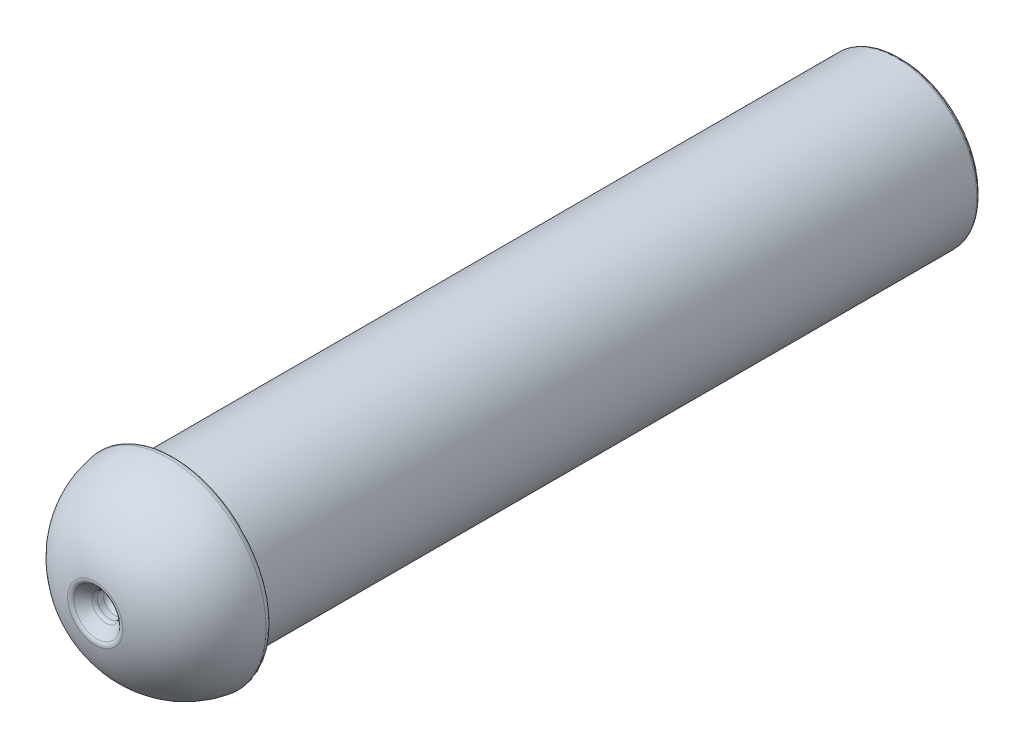
ISO-10303-21;
HEADER;
FILE_DESCRIPTION(('STEP AP214'),'2;1');
FILE_NAME('part.step','',(''),(''),'','','');
FILE_SCHEMA(('AUTOMOTIVE_DESIGN { 1 0 10303 214 1 1 1 1 }'));
ENDSEC;
DATA;
#1=APPLICATION_CONTEXT('core data for automotive mechanical design processes');
#2=APPLICATION_PROTOCOL_DEFINITION('international standard','automotive_design',2000,#1);
#3=PRODUCT_CONTEXT('',#1,'mechanical');
#4=PRODUCT('Part','Part','',(#3));
#5=PRODUCT_RELATED_PRODUCT_CATEGORY('part','',(#4));
#6=PRODUCT_DEFINITION_FORMATION('','',#4);
#7=PRODUCT_DEFINITION_CONTEXT('part definition',#1,'design');
#8=PRODUCT_DEFINITION('design','',#6,#7);
#9=PRODUCT_DEFINITION_SHAPE('','',#8);
#10=(LENGTH_UNIT() NAMED_UNIT(*) SI_UNIT(.MILLI.,.METRE.));
#11=(NAMED_UNIT(*) PLANE_ANGLE_UNIT() SI_UNIT($,.RADIAN.));
#12=(NAMED_UNIT(*) SI_UNIT($,.STERADIAN.) SOLID_ANGLE_UNIT());
#13=UNCERTAINTY_MEASURE_WITH_UNIT(LENGTH_MEASURE(1.E-05),#10,'distance_accuracy_value','');
#14=(GEOMETRIC_REPRESENTATION_CONTEXT(3) GLOBAL_UNCERTAINTY_ASSIGNED_CONTEXT((#13)) GLOBAL_UNIT_ASSIGNED_CONTEXT((#10,
#11,#12)) REPRESENTATION_CONTEXT('',''));
#15=CARTESIAN_POINT('',(0.,0.,0.));
#16=DIRECTION('',(0.,0.,1.));
#17=DIRECTION('',(1.,0.,0.));
#18=AXIS2_PLACEMENT_3D('',#15,#16,#17);
#19=CARTESIAN_POINT('',(0.,0.,27.05));
#20=DIRECTION('',(0.,0.,-1.));
#21=DIRECTION('',(-1.,0.,0.));
#22=AXIS2_PLACEMENT_3D('',#19,#20,#21);
#23=CYLINDRICAL_SURFACE('',#22,3.);
#24=CARTESIAN_POINT('',(0.,0.,0.241421356237306));
#25=DIRECTION('',(0.,0.,-1.));
#26=DIRECTION('',(-1.,0.,0.));
#27=AXIS2_PLACEMENT_3D('',#24,#25,#26);
#28=CIRCLE('',#27,3.);
#29=CARTESIAN_POINT('',(-3.,0.,0.241421356237306));
#30=VERTEX_POINT('',#29);
#31=EDGE_CURVE('E67',#30,#30,#28,.F.);
#32=ORIENTED_EDGE('',*,*,#31,.T.);
#33=EDGE_LOOP('',(#32));
#34=FACE_BOUND('',#33,.T.);
#35=CARTESIAN_POINT('',(0.,0.,27.05));
#36=DIRECTION('',(0.,0.,1.));
#37=DIRECTION('',(1.,0.,0.));
#38=AXIS2_PLACEMENT_3D('',#35,#36,#37);
#39=CIRCLE('',#38,3.);
#40=CARTESIAN_POINT('',(3.,0.,27.05));
#41=VERTEX_POINT('',#40);
#42=EDGE_CURVE('E103',#41,#41,#39,.T.);
#43=ORIENTED_EDGE('',*,*,#42,.F.);
#44=EDGE_LOOP('',(#43));
#45=FACE_BOUND('',#44,.T.);
#46=ADVANCED_FACE('F39',(#34,#45),#23,.T.);
#47=CARTESIAN_POINT('',(0.,0.,0.));
#48=DIRECTION('',(0.,0.,1.));
#49=DIRECTION('',(1.,0.,0.));
#50=AXIS2_PLACEMENT_3D('',#47,#48,#49);
#51=PLANE('',#50);
#52=CARTESIAN_POINT('',(0.,0.,0.));
#53=DIRECTION('',(0.,0.,1.));
#54=DIRECTION('',(1.,0.,0.));
#55=AXIS2_PLACEMENT_3D('',#52,#53,#54);
#56=CIRCLE('',#55,2.75857864376269);
#57=CARTESIAN_POINT('',(2.75857864376269,0.,0.));
#58=VERTEX_POINT('',#57);
#59=EDGE_CURVE('E53',#58,#58,#56,.F.);
#60=ORIENTED_EDGE('',*,*,#59,.T.);
#61=EDGE_LOOP('',(#60));
#62=FACE_BOUND('',#61,.T.);
#63=CARTESIAN_POINT('',(0.,0.,0.));
#64=DIRECTION('',(0.,0.,1.));
#65=DIRECTION('',(1.,0.,0.));
#66=AXIS2_PLACEMENT_3D('',#63,#64,#65);
#67=CIRCLE('',#66,2.6260011275733);
#68=CARTESIAN_POINT('',(2.6260011275733,0.,0.));
#69=VERTEX_POINT('',#68);
#70=EDGE_CURVE('E56',#69,#69,#67,.T.);
#71=ORIENTED_EDGE('',*,*,#70,.T.);
#72=EDGE_LOOP('',(#71));
#73=FACE_BOUND('',#72,.T.);
#74=ADVANCED_FACE('F108',(#62,#73),#51,.F.);
#75=CARTESIAN_POINT('',(0.,0.,27.05));
#76=DIRECTION('',(0.,0.,1.));
#77=DIRECTION('',(1.,0.,0.));
#78=AXIS2_PLACEMENT_3D('',#75,#76,#77);
#79=PLANE('',#78);
#80=CARTESIAN_POINT('',(0.,0.,27.05));
#81=DIRECTION('',(0.,0.,1.));
#82=DIRECTION('',(1.,0.,0.));
#83=AXIS2_PLACEMENT_3D('',#80,#81,#82);
#84=CIRCLE('',#83,3.42811485811091);
#85=CARTESIAN_POINT('',(3.42811485811091,0.,27.05));
#86=VERTEX_POINT('',#85);
#87=EDGE_CURVE('E91',#86,#86,#84,.F.);
#88=ORIENTED_EDGE('',*,*,#87,.T.);
#89=EDGE_LOOP('',(#88));
#90=FACE_BOUND('',#89,.T.);
#91=ORIENTED_EDGE('',*,*,#42,.T.);
#92=EDGE_LOOP('',(#91));
#93=FACE_BOUND('',#92,.T.);
#94=ADVANCED_FACE('F102',(#90,#93),#79,.F.);
#95=CARTESIAN_POINT('',(0.,0.,26.85));
#96=DIRECTION('',(0.,0.,-1.));
#97=DIRECTION('',(-1.,0.,0.));
#98=AXIS2_PLACEMENT_3D('',#95,#96,#97);
#99=DEGENERATE_TOROIDAL_SURFACE('',#98,0.454901108647211,3.2,.T.);
#100=CARTESIAN_POINT('',(0.,0.,29.9987448238278));
#101=DIRECTION('',(0.,0.,-1.));
#102=DIRECTION('',(-1.,0.,0.));
#103=AXIS2_PLACEMENT_3D('',#100,#101,#102);
#104=CIRCLE('',#103,1.02534482578127);
#105=CARTESIAN_POINT('',(-1.02534482578127,0.,29.9987448238278));
#106=VERTEX_POINT('',#105);
#107=EDGE_CURVE('E89',#106,#106,#104,.T.);
#108=ORIENTED_EDGE('',*,*,#107,.T.);
#109=EDGE_LOOP('',(#108));
#110=FACE_BOUND('',#109,.T.);
#111=CARTESIAN_POINT('',(0.,0.,27.2766666666667));
#112=DIRECTION('',(0.,0.,-1.));
#113=DIRECTION('',(-1.,0.,0.));
#114=AXIS2_PLACEMENT_3D('',#111,#112,#113);
#115=CIRCLE('',#114,3.62632910807516);
#116=CARTESIAN_POINT('',(-3.62632910807516,0.,27.2766666666667));
#117=VERTEX_POINT('',#116);
#118=EDGE_CURVE('E96',#117,#117,#115,.F.);
#119=ORIENTED_EDGE('',*,*,#118,.T.);
#120=EDGE_LOOP('',(#119));
#121=FACE_BOUND('',#120,.T.);
#122=ADVANCED_FACE('F118',(#110,#121),#99,.T.);
#123=CARTESIAN_POINT('',(0.,0.,27.25));
#124=DIRECTION('',(0.,0.,1.));
#125=DIRECTION('',(1.,0.,0.));
#126=AXIS2_PLACEMENT_3D('',#123,#124,#125);
#127=TOROIDAL_SURFACE('',#126,3.42811485811091,0.2);
#128=ORIENTED_EDGE('',*,*,#87,.F.);
#129=EDGE_LOOP('',(#128));
#130=FACE_BOUND('',#129,.T.);
#131=ORIENTED_EDGE('',*,*,#118,.F.);
#132=EDGE_LOOP('',(#131));
#133=FACE_BOUND('',#132,.T.);
#134=ADVANCED_FACE('F125',(#130,#133),#127,.T.);
#135=CARTESIAN_POINT('',(0.,0.,29.05));
#136=DIRECTION('',(0.,0.,1.));
#137=DIRECTION('',(1.,0.,0.));
#138=AXIS2_PLACEMENT_3D('',#135,#136,#137);
#139=CYLINDRICAL_SURFACE('',#138,0.454901108647211);
#140=CARTESIAN_POINT('',(0.,0.,29.4671572875254));
#141=DIRECTION('',(0.,0.,-1.));
#142=DIRECTION('',(-1.,0.,0.));
#143=AXIS2_PLACEMENT_3D('',#140,#141,#142);
#144=CIRCLE('',#143,0.454901108647211);
#145=CARTESIAN_POINT('',(-0.454901108647211,0.,29.4671572875254));
#146=VERTEX_POINT('',#145);
#147=EDGE_CURVE('E80',#146,#146,#144,.F.);
#148=ORIENTED_EDGE('',*,*,#147,.T.);
#149=EDGE_LOOP('',(#148));
#150=FACE_BOUND('',#149,.T.);
#151=CARTESIAN_POINT('',(0.,0.,29.25));
#152=DIRECTION('',(0.,0.,1.));
#153=DIRECTION('',(1.,0.,0.));
#154=AXIS2_PLACEMENT_3D('',#151,#152,#153);
#155=CIRCLE('',#154,0.454901108647211);
#156=CARTESIAN_POINT('',(0.454901108647211,0.,29.25));
#157=VERTEX_POINT('',#156);
#158=EDGE_CURVE('E88',#157,#157,#155,.F.);
#159=ORIENTED_EDGE('',*,*,#158,.T.);
#160=EDGE_LOOP('',(#159));
#161=FACE_BOUND('',#160,.T.);
#162=ADVANCED_FACE('F127',(#150,#161),#139,.F.);
#163=CARTESIAN_POINT('',(0.,0.,29.05));
#164=DIRECTION('',(0.,0.,1.));
#165=DIRECTION('',(1.,0.,0.));
#166=AXIS2_PLACEMENT_3D('',#163,#164,#165);
#167=PLANE('',#166);
#168=CARTESIAN_POINT('',(0.,0.,29.05));
#169=DIRECTION('',(0.,0.,1.));
#170=DIRECTION('',(1.,0.,0.));
#171=AXIS2_PLACEMENT_3D('',#168,#169,#170);
#172=CIRCLE('',#171,0.254901108647211);
#173=CARTESIAN_POINT('',(0.254901108647211,0.,29.05));
#174=VERTEX_POINT('',#173);
#175=EDGE_CURVE('E95',#174,#174,#172,.T.);
#176=ORIENTED_EDGE('',*,*,#175,.T.);
#177=EDGE_LOOP('',(#176));
#178=FACE_BOUND('',#177,.T.);
#179=ADVANCED_FACE('F135',(#178),#167,.T.);
#180=CARTESIAN_POINT('',(0.,0.,29.25));
#181=DIRECTION('',(0.,0.,1.));
#182=DIRECTION('',(1.,0.,0.));
#183=AXIS2_PLACEMENT_3D('',#180,#181,#182);
#184=TOROIDAL_SURFACE('',#183,0.254901108647211,0.2);
#185=ORIENTED_EDGE('',*,*,#158,.F.);
#186=EDGE_LOOP('',(#185));
#187=FACE_BOUND('',#186,.T.);
#188=ORIENTED_EDGE('',*,*,#175,.F.);
#189=EDGE_LOOP('',(#188));
#190=FACE_BOUND('',#189,.T.);
#191=ADVANCED_FACE('F129',(#187,#190),#184,.F.);
#192=CARTESIAN_POINT('',(0.,0.,29.55));
#193=DIRECTION('',(0.,0.,1.));
#194=DIRECTION('',(1.,0.,0.));
#195=AXIS2_PLACEMENT_3D('',#192,#193,#194);
#196=CONICAL_SURFACE('',#195,0.454901108647211,0.785398163397455);
#197=CARTESIAN_POINT('',(0.,0.,29.9433696285759));
#198=DIRECTION('',(0.,0.,-1.));
#199=DIRECTION('',(-1.,0.,0.));
#200=AXIS2_PLACEMENT_3D('',#197,#198,#199);
#201=CIRCLE('',#200,0.848270737223083);
#202=CARTESIAN_POINT('',(-0.848270737223083,0.,29.9433696285759));
#203=VERTEX_POINT('',#202);
#204=EDGE_CURVE('E78',#203,#203,#201,.F.);
#205=ORIENTED_EDGE('',*,*,#204,.T.);
#206=EDGE_LOOP('',(#205));
#207=FACE_BOUND('',#206,.T.);
#208=CARTESIAN_POINT('',(0.,0.,29.6085786437627));
#209=DIRECTION('',(0.,0.,1.));
#210=DIRECTION('',(1.,0.,0.));
#211=AXIS2_PLACEMENT_3D('',#208,#209,#210);
#212=CIRCLE('',#211,0.513479752409901);
#213=CARTESIAN_POINT('',(0.513479752409901,0.,29.6085786437627));
#214=VERTEX_POINT('',#213);
#215=EDGE_CURVE('E84',#214,#214,#212,.F.);
#216=ORIENTED_EDGE('',*,*,#215,.T.);
#217=EDGE_LOOP('',(#216));
#218=FACE_BOUND('',#217,.T.);
#219=ADVANCED_FACE('F131',(#207,#218),#196,.F.);
#220=CARTESIAN_POINT('',(0.,0.,29.8019482723385));
#221=DIRECTION('',(0.,0.,1.));
#222=DIRECTION('',(1.,0.,0.));
#223=AXIS2_PLACEMENT_3D('',#220,#221,#222);
#224=TOROIDAL_SURFACE('',#223,0.989692093460391,0.2);
#225=ORIENTED_EDGE('',*,*,#204,.F.);
#226=EDGE_LOOP('',(#225));
#227=FACE_BOUND('',#226,.T.);
#228=ORIENTED_EDGE('',*,*,#107,.F.);
#229=EDGE_LOOP('',(#228));
#230=FACE_BOUND('',#229,.T.);
#231=ADVANCED_FACE('F139',(#227,#230),#224,.T.);
#232=CARTESIAN_POINT('',(0.,0.,29.4671572875254));
#233=DIRECTION('',(0.,0.,-1.));
#234=DIRECTION('',(-1.,0.,0.));
#235=AXIS2_PLACEMENT_3D('',#232,#233,#234);
#236=TOROIDAL_SURFACE('',#235,0.654901108647211,0.2);
#237=ORIENTED_EDGE('',*,*,#215,.F.);
#238=EDGE_LOOP('',(#237));
#239=FACE_BOUND('',#238,.T.);
#240=ORIENTED_EDGE('',*,*,#147,.F.);
#241=EDGE_LOOP('',(#240));
#242=FACE_BOUND('',#241,.T.);
#243=ADVANCED_FACE('F144',(#239,#242),#236,.T.);
#244=CARTESIAN_POINT('',(0.,0.,25.));
#245=DIRECTION('',(0.,0.,-1.));
#246=DIRECTION('',(-1.,0.,0.));
#247=AXIS2_PLACEMENT_3D('',#244,#245,#246);
#248=CYLINDRICAL_SURFACE('',#247,2.38457977133597);
#249=CARTESIAN_POINT('',(0.,0.,0.24142135623733));
#250=DIRECTION('',(0.,0.,1.));
#251=DIRECTION('',(1.,0.,0.));
#252=AXIS2_PLACEMENT_3D('',#249,#250,#251);
#253=CIRCLE('',#252,2.38457977133597);
#254=CARTESIAN_POINT('',(-2.38457977133597,0.,0.24142135623733));
#255=VERTEX_POINT('',#254);
#256=EDGE_CURVE('E10',#255,#255,#253,.F.);
#257=CARTESIAN_POINT('',(0.,0.,24.));
#258=DIRECTION('',(0.,0.,-1.));
#259=DIRECTION('',(-1.,0.,0.));
#260=AXIS2_PLACEMENT_3D('',#257,#258,#259);
#261=CIRCLE('',#260,2.38457977133597);
#262=CARTESIAN_POINT('',(-2.38457977133597,0.,24.));
#263=VERTEX_POINT('',#262);
#264=EDGE_CURVE('E71',#263,#263,#261,.F.);
#265=CARTESIAN_POINT('',(-2.38457977133597,0.,0.24142135623733));
#266=CARTESIAN_POINT('',(-2.38457977133597,0.,0.488906550443191));
#267=CARTESIAN_POINT('',(-2.38457977133597,0.,0.736391744649051));
#268=CARTESIAN_POINT('',(-2.38457977133597,0.,1.23136213306077));
#269=CARTESIAN_POINT('',(-2.38457977133597,0.,1.47884732726664));
#270=CARTESIAN_POINT('',(-2.38457977133597,0.,1.97381771567836));
#271=CARTESIAN_POINT('',(-2.38457977133597,0.,2.22130290988422));
#272=CARTESIAN_POINT('',(-2.38457977133597,0.,2.71627329829594));
#273=CARTESIAN_POINT('',(-2.38457977133597,0.,2.96375849250181));
#274=CARTESIAN_POINT('',(-2.38457977133597,0.,3.45872888091353));
#275=CARTESIAN_POINT('',(-2.38457977133597,0.,3.70621407511939));
#276=CARTESIAN_POINT('',(-2.38457977133597,0.,4.20118446353111));
#277=CARTESIAN_POINT('',(-2.38457977133597,0.,4.44866965773697));
#278=CARTESIAN_POINT('',(-2.38457977133597,0.,4.94364004614869));
#279=CARTESIAN_POINT('',(-2.38457977133597,0.,5.19112524035456));
#280=CARTESIAN_POINT('',(-2.38457977133597,0.,5.68609562876628));
#281=CARTESIAN_POINT('',(-2.38457977133597,0.,5.93358082297214));
#282=CARTESIAN_POINT('',(-2.38457977133597,0.,6.42855121138386));
#283=CARTESIAN_POINT('',(-2.38457977133597,0.,6.67603640558972));
#284=CARTESIAN_POINT('',(-2.38457977133597,0.,7.17100679400145));
#285=CARTESIAN_POINT('',(-2.38457977133597,0.,7.41849198820731));
#286=CARTESIAN_POINT('',(-2.38457977133597,0.,7.91346237661903));
#287=CARTESIAN_POINT('',(-2.38457977133597,0.,8.16094757082489));
#288=CARTESIAN_POINT('',(-2.38457977133597,0.,8.65591795923661));
#289=CARTESIAN_POINT('',(-2.38457977133597,0.,8.90340315344248));
#290=CARTESIAN_POINT('',(-2.38457977133597,0.,9.3983735418542));
#291=CARTESIAN_POINT('',(-2.38457977133597,0.,9.64585873606006));
#292=CARTESIAN_POINT('',(-2.38457977133597,0.,10.1408291244718));
#293=CARTESIAN_POINT('',(-2.38457977133597,0.,10.3883143186776));
#294=CARTESIAN_POINT('',(-2.38457977133597,0.,10.8832847070894));
#295=CARTESIAN_POINT('',(-2.38457977133597,0.,11.1307699012952));
#296=CARTESIAN_POINT('',(-2.38457977133597,0.,11.6257402897069));
#297=CARTESIAN_POINT('',(-2.38457977133597,0.,11.8732254839128));
#298=CARTESIAN_POINT('',(-2.38457977133597,0.,12.3681958723245));
#299=CARTESIAN_POINT('',(-2.38457977133597,0.,12.6156810665304));
#300=CARTESIAN_POINT('',(-2.38457977133597,0.,13.1106514549421));
#301=CARTESIAN_POINT('',(-2.38457977133597,0.,13.358136649148));
#302=CARTESIAN_POINT('',(-2.38457977133597,0.,13.8531070375597));
#303=CARTESIAN_POINT('',(-2.38457977133597,0.,14.1005922317656));
#304=CARTESIAN_POINT('',(-2.38457977133597,0.,14.5955626201773));
#305=CARTESIAN_POINT('',(-2.38457977133597,0.,14.8430478143831));
#306=CARTESIAN_POINT('',(-2.38457977133597,0.,15.3380182027949));
#307=CARTESIAN_POINT('',(-2.38457977133597,0.,15.5855033970007));
#308=CARTESIAN_POINT('',(-2.38457977133597,0.,16.0804737854125));
#309=CARTESIAN_POINT('',(-2.38457977133597,0.,16.3279589796183));
#310=CARTESIAN_POINT('',(-2.38457977133597,0.,16.82292936803));
#311=CARTESIAN_POINT('',(-2.38457977133597,0.,17.0704145622359));
#312=CARTESIAN_POINT('',(-2.38457977133597,0.,17.5653849506476));
#313=CARTESIAN_POINT('',(-2.38457977133597,0.,17.8128701448535));
#314=CARTESIAN_POINT('',(-2.38457977133597,0.,18.3078405332652));
#315=CARTESIAN_POINT('',(-2.38457977133597,0.,18.5553257274711));
#316=CARTESIAN_POINT('',(-2.38457977133597,0.,19.0502961158828));
#317=CARTESIAN_POINT('',(-2.38457977133597,0.,19.2977813100886));
#318=CARTESIAN_POINT('',(-2.38457977133597,0.,19.7927516985004));
#319=CARTESIAN_POINT('',(-2.38457977133597,0.,20.0402368927062));
#320=CARTESIAN_POINT('',(-2.38457977133597,0.,20.535207281118));
#321=CARTESIAN_POINT('',(-2.38457977133597,0.,20.7826924753238));
#322=CARTESIAN_POINT('',(-2.38457977133597,0.,21.2776628637355));
#323=CARTESIAN_POINT('',(-2.38457977133597,0.,21.5251480579414));
#324=CARTESIAN_POINT('',(-2.38457977133597,0.,22.0201184463531));
#325=CARTESIAN_POINT('',(-2.38457977133597,0.,22.267603640559));
#326=CARTESIAN_POINT('',(-2.38457977133597,0.,22.7625740289707));
#327=CARTESIAN_POINT('',(-2.38457977133597,0.,23.0100592231766));
#328=CARTESIAN_POINT('',(-2.38457977133597,0.,23.5050296115883));
#329=CARTESIAN_POINT('',(-2.38457977133597,0.,23.7525148057941));
#330=CARTESIAN_POINT('',(-2.38457977133597,0.,24.));
#331=B_SPLINE_CURVE_WITH_KNOTS('',3,(#265,#266,#267,#268,#269,#270,#271,#272,#273,#274,#275,
#276,#277,#278,#279,#280,#281,#282,#283,#284,#285,#286,#287,#288,#289,#290,#291,#292,#293,#294,
#295,#296,#297,#298,#299,#300,#301,#302,#303,#304,#305,#306,#307,#308,#309,#310,#311,#312,#313,
#314,#315,#316,#317,#318,#319,#320,#321,#322,#323,#324,#325,#326,#327,#328,#329,#330),
.UNSPECIFIED.,.F.,.F.,(4,2,2,2,2,2,2,2,2,2,2,2,2,2,2,2,2,2,2,2,2,2,2,2,2,2,2,2,2,2,2,2,4),(0.,
0.742455582617582,1.48491116523517,2.22736674785275,2.96982233047034,3.71227791308792,
4.4547334957055,5.19718907832309,5.93964466094067,6.68210024355825,7.42455582617584,
8.16701140879342,8.90946699141101,9.65192257402859,10.3943781566462,11.1368337392638,
11.8792893218813,12.6217449044989,13.3642004871165,14.1066560697341,14.8491116523517,
15.5915672349693,16.3340228175868,17.0764784002044,17.818933982822,18.5613895654396,
19.3038451480572,20.0463007306748,20.7887563132923,21.5312118959099,22.2736674785275,
23.0161230611451,23.7585786437627),.UNSPECIFIED.);
#332=EDGE_CURVE('BSEAM149',#255,#263,#331,.T.);
#333=ORIENTED_EDGE('',*,*,#256,.T.);
#334=ORIENTED_EDGE('',*,*,#264,.T.);
#335=ORIENTED_EDGE('',*,*,#332,.T.);
#336=ORIENTED_EDGE('',*,*,#332,.F.);
#337=EDGE_LOOP('',(#333,#335,#334,#336));
#338=FACE_BOUND('',#337,.T.);
#339=ADVANCED_FACE('F149',(#338),#248,.F.);
#340=CARTESIAN_POINT('',(0.,0.,25.));
#341=DIRECTION('',(0.,0.,-1.));
#342=DIRECTION('',(-1.,0.,0.));
#343=AXIS2_PLACEMENT_3D('',#340,#341,#342);
#344=PLANE('',#343);
#345=CARTESIAN_POINT('',(0.,0.,25.));
#346=DIRECTION('',(0.,0.,-1.));
#347=DIRECTION('',(-1.,0.,0.));
#348=AXIS2_PLACEMENT_3D('',#345,#346,#347);
#349=CIRCLE('',#348,1.38457977133597);
#350=CARTESIAN_POINT('',(-1.38457977133597,0.,25.));
#351=VERTEX_POINT('',#350);
#352=EDGE_CURVE('E72',#351,#351,#349,.T.);
#353=ORIENTED_EDGE('',*,*,#352,.T.);
#354=EDGE_LOOP('',(#353));
#355=FACE_BOUND('',#354,.T.);
#356=ADVANCED_FACE('F155',(#355),#344,.T.);
#357=CARTESIAN_POINT('',(0.,0.,24.));
#358=DIRECTION('',(0.,0.,-1.));
#359=DIRECTION('',(-1.,0.,0.));
#360=AXIS2_PLACEMENT_3D('',#357,#358,#359);
#361=TOROIDAL_SURFACE('',#360,1.38457977133597,1.);
#362=ORIENTED_EDGE('',*,*,#264,.F.);
#363=EDGE_LOOP('',(#362));
#364=FACE_BOUND('',#363,.T.);
#365=ORIENTED_EDGE('',*,*,#352,.F.);
#366=EDGE_LOOP('',(#365));
#367=FACE_BOUND('',#366,.T.);
#368=ADVANCED_FACE('F148',(#364,#367),#361,.F.);
#369=CARTESIAN_POINT('',(0.,0.,0.199999999999995));
#370=DIRECTION('',(0.,0.,1.));
#371=DIRECTION('',(1.,0.,0.));
#372=AXIS2_PLACEMENT_3D('',#369,#370,#371);
#373=CONICAL_SURFACE('',#372,3.,0.785398163397449);
#374=CARTESIAN_POINT('',(0.,0.,0.170710678118651));
#375=DIRECTION('',(0.,0.,1.));
#376=DIRECTION('',(1.,0.,0.));
#377=AXIS2_PLACEMENT_3D('',#374,#375,#376);
#378=CIRCLE('',#377,2.97071067811865);
#379=CARTESIAN_POINT('',(2.97071067811865,0.,0.170710678118651));
#380=VERTEX_POINT('',#379);
#381=EDGE_CURVE('E65',#380,#380,#378,.F.);
#382=ORIENTED_EDGE('',*,*,#381,.T.);
#383=EDGE_LOOP('',(#382));
#384=FACE_BOUND('',#383,.T.);
#385=CARTESIAN_POINT('',(0.,0.,0.029289321881345));
#386=DIRECTION('',(0.,0.,1.));
#387=DIRECTION('',(1.,0.,0.));
#388=AXIS2_PLACEMENT_3D('',#385,#386,#387);
#389=CIRCLE('',#388,2.82928932188135);
#390=CARTESIAN_POINT('',(2.82928932188135,0.,0.029289321881345));
#391=VERTEX_POINT('',#390);
#392=EDGE_CURVE('E63',#391,#391,#389,.T.);
#393=ORIENTED_EDGE('',*,*,#392,.T.);
#394=EDGE_LOOP('',(#393));
#395=FACE_BOUND('',#394,.T.);
#396=ADVANCED_FACE('F151',(#384,#395),#373,.T.);
#397=CARTESIAN_POINT('',(0.,0.,0.20000000000002));
#398=DIRECTION('',(0.,0.,-1.));
#399=DIRECTION('',(-1.,0.,0.));
#400=AXIS2_PLACEMENT_3D('',#397,#398,#399);
#401=CONICAL_SURFACE('',#400,2.38457977133597,0.785398163397456);
#402=CARTESIAN_POINT('',(0.,0.,0.0292893218813445));
#403=DIRECTION('',(0.,0.,-1.));
#404=DIRECTION('',(-1.,0.,0.));
#405=AXIS2_PLACEMENT_3D('',#402,#403,#404);
#406=CIRCLE('',#405,2.55529044945465);
#407=CARTESIAN_POINT('',(-2.55529044945465,0.,0.0292893218813445));
#408=VERTEX_POINT('',#407);
#409=EDGE_CURVE('E46',#408,#408,#406,.T.);
#410=ORIENTED_EDGE('',*,*,#409,.T.);
#411=EDGE_LOOP('',(#410));
#412=FACE_BOUND('',#411,.T.);
#413=CARTESIAN_POINT('',(0.,0.,0.170710678118675));
#414=DIRECTION('',(0.,0.,-1.));
#415=DIRECTION('',(-1.,0.,0.));
#416=AXIS2_PLACEMENT_3D('',#413,#414,#415);
#417=CIRCLE('',#416,2.41386909321732);
#418=CARTESIAN_POINT('',(-2.41386909321732,0.,0.170710678118675));
#419=VERTEX_POINT('',#418);
#420=EDGE_CURVE('E49',#419,#419,#417,.F.);
#421=ORIENTED_EDGE('',*,*,#420,.T.);
#422=EDGE_LOOP('',(#421));
#423=FACE_BOUND('',#422,.T.);
#424=ADVANCED_FACE('F156',(#412,#423),#401,.F.);
#425=CARTESIAN_POINT('',(0.,0.,0.241421356237306));
#426=DIRECTION('',(0.,0.,-1.));
#427=DIRECTION('',(-1.,0.,0.));
#428=AXIS2_PLACEMENT_3D('',#425,#426,#427);
#429=TOROIDAL_SURFACE('',#428,2.9,0.1);
#430=ORIENTED_EDGE('',*,*,#381,.F.);
#431=EDGE_LOOP('',(#430));
#432=FACE_BOUND('',#431,.T.);
#433=ORIENTED_EDGE('',*,*,#31,.F.);
#434=EDGE_LOOP('',(#433));
#435=FACE_BOUND('',#434,.T.);
#436=ADVANCED_FACE('F168',(#432,#435),#429,.T.);
#437=CARTESIAN_POINT('',(0.,0.,0.1));
#438=DIRECTION('',(0.,0.,1.));
#439=DIRECTION('',(1.,0.,0.));
#440=AXIS2_PLACEMENT_3D('',#437,#438,#439);
#441=TOROIDAL_SURFACE('',#440,2.75857864376269,0.1);
#442=ORIENTED_EDGE('',*,*,#392,.F.);
#443=EDGE_LOOP('',(#442));
#444=FACE_BOUND('',#443,.T.);
#445=ORIENTED_EDGE('',*,*,#59,.F.);
#446=EDGE_LOOP('',(#445));
#447=FACE_BOUND('',#446,.T.);
#448=ADVANCED_FACE('F169',(#444,#447),#441,.T.);
#449=CARTESIAN_POINT('',(0.,0.,0.1));
#450=DIRECTION('',(0.,0.,1.));
#451=DIRECTION('',(1.,0.,0.));
#452=AXIS2_PLACEMENT_3D('',#449,#450,#451);
#453=TOROIDAL_SURFACE('',#452,2.6260011275733,0.1);
#454=ORIENTED_EDGE('',*,*,#409,.F.);
#455=EDGE_LOOP('',(#454));
#456=FACE_BOUND('',#455,.T.);
#457=ORIENTED_EDGE('',*,*,#70,.F.);
#458=EDGE_LOOP('',(#457));
#459=FACE_BOUND('',#458,.T.);
#460=ADVANCED_FACE('F175',(#456,#459),#453,.T.);
#461=CARTESIAN_POINT('',(0.,0.,0.24142135623733));
#462=DIRECTION('',(0.,0.,1.));
#463=DIRECTION('',(1.,0.,0.));
#464=AXIS2_PLACEMENT_3D('',#461,#462,#463);
#465=TOROIDAL_SURFACE('',#464,2.48457977133597,0.1);
#466=ORIENTED_EDGE('',*,*,#420,.F.);
#467=EDGE_LOOP('',(#466));
#468=FACE_BOUND('',#467,.T.);
#469=ORIENTED_EDGE('',*,*,#256,.F.);
#470=EDGE_LOOP('',(#469));
#471=FACE_BOUND('',#470,.T.);
#472=ADVANCED_FACE('F41',(#468,#471),#465,.T.);
#473=CLOSED_SHELL('',(#46,#74,#94,#122,#134,#162,#179,#191,#219,#231,#243,#339,#356,#368,#396,
#424,#436,#448,#460,#472));
#474=MANIFOLD_SOLID_BREP('B2',#473);
#475=ADVANCED_BREP_SHAPE_REPRESENTATION('',(#18,#474),#14);
#476=SHAPE_DEFINITION_REPRESENTATION(#9,#475);
ENDSEC;
END-ISO-10303-21;
